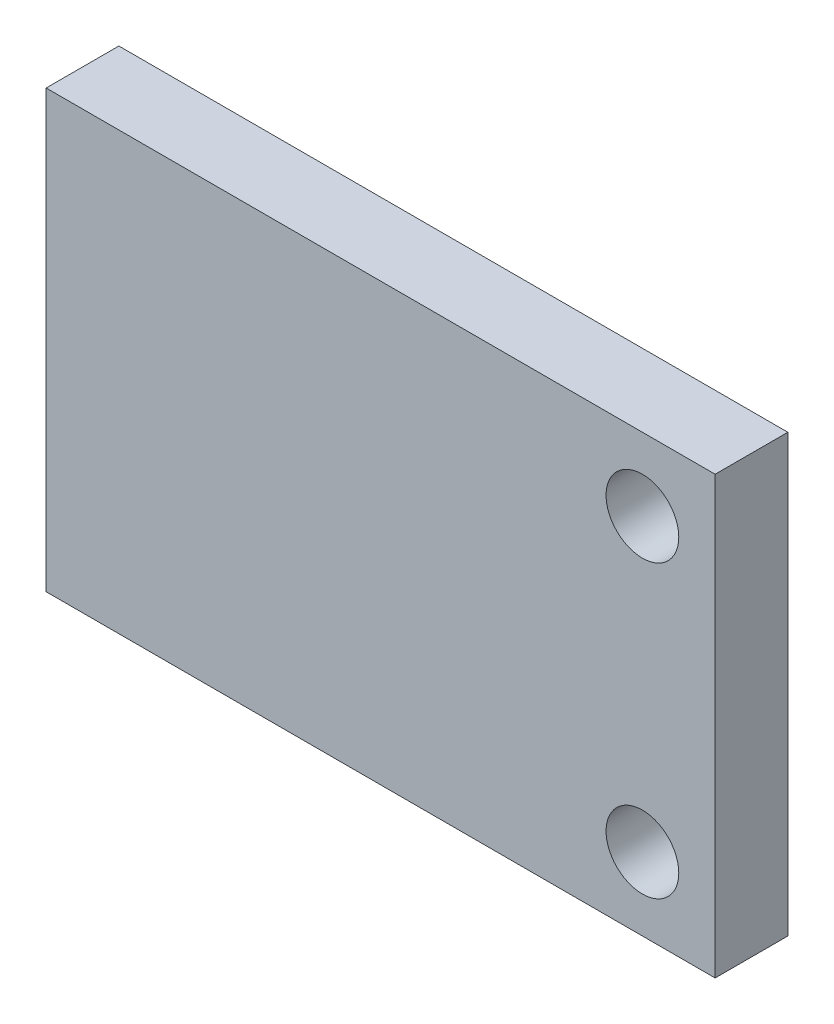
ISO-10303-21;
HEADER;
FILE_DESCRIPTION(('STEP AP214'),'2;1');
FILE_NAME('part.step','',(''),(''),'','','');
FILE_SCHEMA(('AUTOMOTIVE_DESIGN { 1 0 10303 214 1 1 1 1 }'));
ENDSEC;
DATA;
#1=APPLICATION_CONTEXT('core data for automotive mechanical design processes');
#2=APPLICATION_PROTOCOL_DEFINITION('international standard','automotive_design',2000,#1);
#3=PRODUCT_CONTEXT('',#1,'mechanical');
#4=PRODUCT('Part','Part','',(#3));
#5=PRODUCT_RELATED_PRODUCT_CATEGORY('part','',(#4));
#6=PRODUCT_DEFINITION_FORMATION('','',#4);
#7=PRODUCT_DEFINITION_CONTEXT('part definition',#1,'design');
#8=PRODUCT_DEFINITION('design','',#6,#7);
#9=PRODUCT_DEFINITION_SHAPE('','',#8);
#10=(LENGTH_UNIT() NAMED_UNIT(*) SI_UNIT(.MILLI.,.METRE.));
#11=(NAMED_UNIT(*) PLANE_ANGLE_UNIT() SI_UNIT($,.RADIAN.));
#12=(NAMED_UNIT(*) SI_UNIT($,.STERADIAN.) SOLID_ANGLE_UNIT());
#13=UNCERTAINTY_MEASURE_WITH_UNIT(LENGTH_MEASURE(1.E-05),#10,'distance_accuracy_value','');
#14=(GEOMETRIC_REPRESENTATION_CONTEXT(3) GLOBAL_UNCERTAINTY_ASSIGNED_CONTEXT((#13)) GLOBAL_UNIT_ASSIGNED_CONTEXT((#10,
#11,#12)) REPRESENTATION_CONTEXT('',''));
#15=CARTESIAN_POINT('',(0.,0.,0.));
#16=DIRECTION('',(0.,0.,1.));
#17=DIRECTION('',(1.,0.,0.));
#18=AXIS2_PLACEMENT_3D('',#15,#16,#17);
#19=CARTESIAN_POINT('',(0.,0.,10.));
#20=DIRECTION('',(0.,0.,1.));
#21=DIRECTION('',(1.,0.,0.));
#22=AXIS2_PLACEMENT_3D('',#19,#20,#21);
#23=PLANE('',#22);
#24=CARTESIAN_POINT('',(36.,-20.,10.));
#25=DIRECTION('',(0.,0.,1.));
#26=DIRECTION('',(1.,0.,0.));
#27=AXIS2_PLACEMENT_3D('',#24,#25,#26);
#28=CIRCLE('',#27,5.);
#29=CARTESIAN_POINT('',(41.,-20.,10.));
#30=VERTEX_POINT('',#29);
#31=EDGE_CURVE('E119',#30,#30,#28,.T.);
#32=ORIENTED_EDGE('',*,*,#31,.F.);
#33=EDGE_LOOP('',(#32));
#34=FACE_BOUND('',#33,.T.);
#35=DIRECTION('',(0.,1.,0.));
#36=VECTOR('',#35,1.);
#37=CARTESIAN_POINT('',(46.,30.,10.));
#38=LINE('',#37,#36);
#39=CARTESIAN_POINT('',(46.,-30.,10.));
#40=VERTEX_POINT('',#39);
#41=CARTESIAN_POINT('',(46.,30.,10.));
#42=VERTEX_POINT('',#41);
#43=EDGE_CURVE('E96',#40,#42,#38,.T.);
#44=ORIENTED_EDGE('',*,*,#43,.T.);
#45=DIRECTION('',(-1.,0.,0.));
#46=VECTOR('',#45,1.);
#47=CARTESIAN_POINT('',(-46.,30.,10.));
#48=LINE('',#47,#46);
#49=CARTESIAN_POINT('',(-46.,30.,10.));
#50=VERTEX_POINT('',#49);
#51=EDGE_CURVE('E91',#42,#50,#48,.T.);
#52=ORIENTED_EDGE('',*,*,#51,.T.);
#53=DIRECTION('',(0.,-1.,0.));
#54=VECTOR('',#53,1.);
#55=CARTESIAN_POINT('',(-46.,30.,10.));
#56=LINE('',#55,#54);
#57=CARTESIAN_POINT('',(-46.,-30.,10.));
#58=VERTEX_POINT('',#57);
#59=EDGE_CURVE('E94',#50,#58,#56,.T.);
#60=ORIENTED_EDGE('',*,*,#59,.T.);
#61=DIRECTION('',(1.,0.,0.));
#62=VECTOR('',#61,1.);
#63=CARTESIAN_POINT('',(-46.,-30.,10.));
#64=LINE('',#63,#62);
#65=EDGE_CURVE('E61',#58,#40,#64,.T.);
#66=ORIENTED_EDGE('',*,*,#65,.T.);
#67=EDGE_LOOP('',(#44,#52,#60,#66));
#68=FACE_BOUND('',#67,.T.);
#69=CARTESIAN_POINT('',(36.,20.,10.));
#70=DIRECTION('',(0.,0.,1.));
#71=DIRECTION('',(1.,0.,0.));
#72=AXIS2_PLACEMENT_3D('',#69,#70,#71);
#73=CIRCLE('',#72,5.);
#74=CARTESIAN_POINT('',(41.,20.,10.));
#75=VERTEX_POINT('',#74);
#76=EDGE_CURVE('E142',#75,#75,#73,.T.);
#77=ORIENTED_EDGE('',*,*,#76,.F.);
#78=EDGE_LOOP('',(#77));
#79=FACE_BOUND('',#78,.T.);
#80=ADVANCED_FACE('F43',(#34,#68,#79),#23,.T.);
#81=CARTESIAN_POINT('',(0.,0.,0.));
#82=DIRECTION('',(0.,0.,1.));
#83=DIRECTION('',(1.,0.,0.));
#84=AXIS2_PLACEMENT_3D('',#81,#82,#83);
#85=PLANE('',#84);
#86=DIRECTION('',(0.,1.,0.));
#87=VECTOR('',#86,1.);
#88=CARTESIAN_POINT('',(46.,30.,0.));
#89=LINE('',#88,#87);
#90=CARTESIAN_POINT('',(46.,-30.,0.));
#91=VERTEX_POINT('',#90);
#92=CARTESIAN_POINT('',(46.,30.,0.));
#93=VERTEX_POINT('',#92);
#94=EDGE_CURVE('E115',#91,#93,#89,.T.);
#95=ORIENTED_EDGE('',*,*,#94,.F.);
#96=DIRECTION('',(1.,0.,0.));
#97=VECTOR('',#96,1.);
#98=CARTESIAN_POINT('',(-46.,-30.,0.));
#99=LINE('',#98,#97);
#100=CARTESIAN_POINT('',(-46.,-30.,0.));
#101=VERTEX_POINT('',#100);
#102=EDGE_CURVE('E84',#101,#91,#99,.T.);
#103=ORIENTED_EDGE('',*,*,#102,.F.);
#104=DIRECTION('',(0.,-1.,0.));
#105=VECTOR('',#104,1.);
#106=CARTESIAN_POINT('',(-46.,30.,0.));
#107=LINE('',#106,#105);
#108=CARTESIAN_POINT('',(-46.,30.,0.));
#109=VERTEX_POINT('',#108);
#110=EDGE_CURVE('E78',#109,#101,#107,.T.);
#111=ORIENTED_EDGE('',*,*,#110,.F.);
#112=DIRECTION('',(-1.,0.,0.));
#113=VECTOR('',#112,1.);
#114=CARTESIAN_POINT('',(-46.,30.,0.));
#115=LINE('',#114,#113);
#116=EDGE_CURVE('E101',#93,#109,#115,.T.);
#117=ORIENTED_EDGE('',*,*,#116,.F.);
#118=EDGE_LOOP('',(#95,#103,#111,#117));
#119=FACE_BOUND('',#118,.T.);
#120=CARTESIAN_POINT('',(36.,-20.,0.));
#121=DIRECTION('',(0.,0.,1.));
#122=DIRECTION('',(1.,0.,0.));
#123=AXIS2_PLACEMENT_3D('',#120,#121,#122);
#124=CIRCLE('',#123,5.);
#125=CARTESIAN_POINT('',(41.,-20.,0.));
#126=VERTEX_POINT('',#125);
#127=EDGE_CURVE('E138',#126,#126,#124,.T.);
#128=ORIENTED_EDGE('',*,*,#127,.T.);
#129=EDGE_LOOP('',(#128));
#130=FACE_BOUND('',#129,.T.);
#131=CARTESIAN_POINT('',(36.,20.,0.));
#132=DIRECTION('',(0.,0.,1.));
#133=DIRECTION('',(1.,0.,0.));
#134=AXIS2_PLACEMENT_3D('',#131,#132,#133);
#135=CIRCLE('',#134,5.);
#136=CARTESIAN_POINT('',(41.,20.,0.));
#137=VERTEX_POINT('',#136);
#138=EDGE_CURVE('E145',#137,#137,#135,.T.);
#139=ORIENTED_EDGE('',*,*,#138,.T.);
#140=EDGE_LOOP('',(#139));
#141=FACE_BOUND('',#140,.T.);
#142=ADVANCED_FACE('F132',(#119,#130,#141),#85,.F.);
#143=CARTESIAN_POINT('',(46.,30.,10.));
#144=DIRECTION('',(-1.,0.,0.));
#145=DIRECTION('',(0.,0.,1.));
#146=AXIS2_PLACEMENT_3D('',#143,#144,#145);
#147=PLANE('',#146);
#148=ORIENTED_EDGE('',*,*,#94,.T.);
#149=DIRECTION('',(0.,0.,-1.));
#150=VECTOR('',#149,1.);
#151=CARTESIAN_POINT('',(46.,30.,10.));
#152=LINE('',#151,#150);
#153=EDGE_CURVE('E11',#42,#93,#152,.T.);
#154=ORIENTED_EDGE('',*,*,#153,.F.);
#155=ORIENTED_EDGE('',*,*,#43,.F.);
#156=DIRECTION('',(0.,0.,-1.));
#157=VECTOR('',#156,1.);
#158=CARTESIAN_POINT('',(46.,-30.,10.));
#159=LINE('',#158,#157);
#160=EDGE_CURVE('E111',#40,#91,#159,.T.);
#161=ORIENTED_EDGE('',*,*,#160,.T.);
#162=EDGE_LOOP('',(#148,#154,#155,#161));
#163=FACE_BOUND('',#162,.T.);
#164=ADVANCED_FACE('F45',(#163),#147,.F.);
#165=CARTESIAN_POINT('',(-46.,30.,10.));
#166=DIRECTION('',(0.,-1.,0.));
#167=DIRECTION('',(0.,0.,-1.));
#168=AXIS2_PLACEMENT_3D('',#165,#166,#167);
#169=PLANE('',#168);
#170=ORIENTED_EDGE('',*,*,#116,.T.);
#171=DIRECTION('',(0.,0.,-1.));
#172=VECTOR('',#171,1.);
#173=CARTESIAN_POINT('',(-46.,30.,10.));
#174=LINE('',#173,#172);
#175=EDGE_CURVE('E53',#50,#109,#174,.T.);
#176=ORIENTED_EDGE('',*,*,#175,.F.);
#177=ORIENTED_EDGE('',*,*,#51,.F.);
#178=ORIENTED_EDGE('',*,*,#153,.T.);
#179=EDGE_LOOP('',(#170,#176,#177,#178));
#180=FACE_BOUND('',#179,.T.);
#181=ADVANCED_FACE('F100',(#180),#169,.F.);
#182=CARTESIAN_POINT('',(-46.,30.,10.));
#183=DIRECTION('',(1.,0.,0.));
#184=DIRECTION('',(0.,0.,-1.));
#185=AXIS2_PLACEMENT_3D('',#182,#183,#184);
#186=PLANE('',#185);
#187=ORIENTED_EDGE('',*,*,#110,.T.);
#188=DIRECTION('',(0.,0.,-1.));
#189=VECTOR('',#188,1.);
#190=CARTESIAN_POINT('',(-46.,-30.,10.));
#191=LINE('',#190,#189);
#192=EDGE_CURVE('E103',#58,#101,#191,.T.);
#193=ORIENTED_EDGE('',*,*,#192,.F.);
#194=ORIENTED_EDGE('',*,*,#59,.F.);
#195=ORIENTED_EDGE('',*,*,#175,.T.);
#196=EDGE_LOOP('',(#187,#193,#194,#195));
#197=FACE_BOUND('',#196,.T.);
#198=ADVANCED_FACE('F104',(#197),#186,.F.);
#199=CARTESIAN_POINT('',(-46.,-30.,10.));
#200=DIRECTION('',(0.,1.,0.));
#201=DIRECTION('',(0.,0.,1.));
#202=AXIS2_PLACEMENT_3D('',#199,#200,#201);
#203=PLANE('',#202);
#204=ORIENTED_EDGE('',*,*,#102,.T.);
#205=ORIENTED_EDGE('',*,*,#160,.F.);
#206=ORIENTED_EDGE('',*,*,#65,.F.);
#207=ORIENTED_EDGE('',*,*,#192,.T.);
#208=EDGE_LOOP('',(#204,#205,#206,#207));
#209=FACE_BOUND('',#208,.T.);
#210=ADVANCED_FACE('F129',(#209),#203,.F.);
#211=CARTESIAN_POINT('',(36.,-20.,10.));
#212=DIRECTION('',(0.,0.,-1.));
#213=DIRECTION('',(-1.,0.,0.));
#214=AXIS2_PLACEMENT_3D('',#211,#212,#213);
#215=CYLINDRICAL_SURFACE('',#214,5.);
#216=ORIENTED_EDGE('',*,*,#31,.T.);
#217=EDGE_LOOP('',(#216));
#218=FACE_BOUND('',#217,.T.);
#219=ORIENTED_EDGE('',*,*,#127,.F.);
#220=EDGE_LOOP('',(#219));
#221=FACE_BOUND('',#220,.T.);
#222=ADVANCED_FACE('F165',(#218,#221),#215,.F.);
#223=CARTESIAN_POINT('',(36.,20.,10.));
#224=DIRECTION('',(0.,0.,-1.));
#225=DIRECTION('',(-1.,0.,0.));
#226=AXIS2_PLACEMENT_3D('',#223,#224,#225);
#227=CYLINDRICAL_SURFACE('',#226,5.);
#228=ORIENTED_EDGE('',*,*,#76,.T.);
#229=EDGE_LOOP('',(#228));
#230=FACE_BOUND('',#229,.T.);
#231=ORIENTED_EDGE('',*,*,#138,.F.);
#232=EDGE_LOOP('',(#231));
#233=FACE_BOUND('',#232,.T.);
#234=ADVANCED_FACE('F154',(#230,#233),#227,.F.);
#235=CLOSED_SHELL('',(#80,#142,#164,#181,#198,#210,#222,#234));
#236=MANIFOLD_SOLID_BREP('B2',#235);
#237=ADVANCED_BREP_SHAPE_REPRESENTATION('',(#18,#236),#14);
#238=SHAPE_DEFINITION_REPRESENTATION(#9,#237);
ENDSEC;
END-ISO-10303-21;
